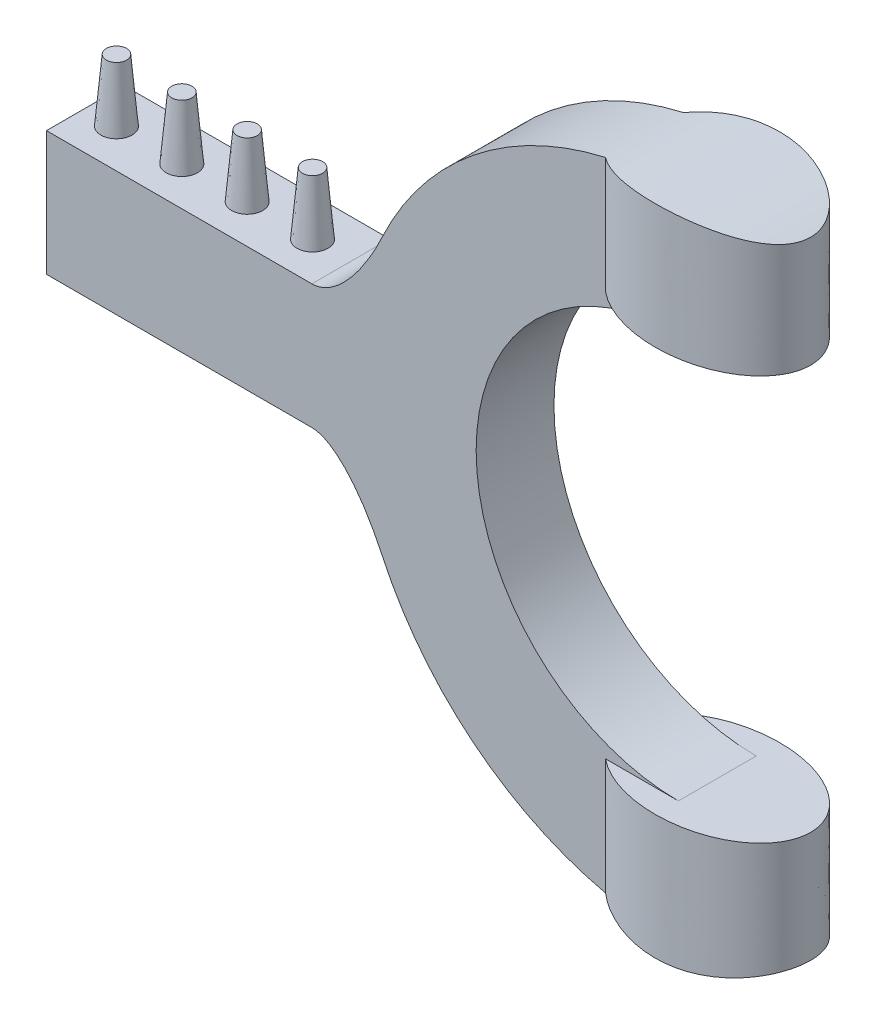
ISO-10303-21;
HEADER;
FILE_DESCRIPTION(('STEP AP214'),'2;1');
FILE_NAME('part.step','',(''),(''),'','','');
FILE_SCHEMA(('AUTOMOTIVE_DESIGN { 1 0 10303 214 1 1 1 1 }'));
ENDSEC;
DATA;
#1=APPLICATION_CONTEXT('core data for automotive mechanical design processes');
#2=APPLICATION_PROTOCOL_DEFINITION('international standard','automotive_design',2000,#1);
#3=PRODUCT_CONTEXT('',#1,'mechanical');
#4=PRODUCT('Part','Part','',(#3));
#5=PRODUCT_RELATED_PRODUCT_CATEGORY('part','',(#4));
#6=PRODUCT_DEFINITION_FORMATION('','',#4);
#7=PRODUCT_DEFINITION_CONTEXT('part definition',#1,'design');
#8=PRODUCT_DEFINITION('design','',#6,#7);
#9=PRODUCT_DEFINITION_SHAPE('','',#8);
#10=(LENGTH_UNIT() NAMED_UNIT(*) SI_UNIT(.MILLI.,.METRE.));
#11=(NAMED_UNIT(*) PLANE_ANGLE_UNIT() SI_UNIT($,.RADIAN.));
#12=(NAMED_UNIT(*) SI_UNIT($,.STERADIAN.) SOLID_ANGLE_UNIT());
#13=UNCERTAINTY_MEASURE_WITH_UNIT(LENGTH_MEASURE(1.E-05),#10,'distance_accuracy_value','');
#14=(GEOMETRIC_REPRESENTATION_CONTEXT(3) GLOBAL_UNCERTAINTY_ASSIGNED_CONTEXT((#13)) GLOBAL_UNIT_ASSIGNED_CONTEXT((#10,
#11,#12)) REPRESENTATION_CONTEXT('',''));
#15=CARTESIAN_POINT('',(0.,0.,0.));
#16=DIRECTION('',(0.,0.,1.));
#17=DIRECTION('',(1.,0.,0.));
#18=AXIS2_PLACEMENT_3D('',#15,#16,#17);
#19=CARTESIAN_POINT('',(0.,0.,1.25));
#20=DIRECTION('',(0.,0.,1.));
#21=DIRECTION('',(1.,0.,0.));
#22=AXIS2_PLACEMENT_3D('',#19,#20,#21);
#23=PLANE('',#22);
#24=DIRECTION('',(0.,1.,0.));
#25=VECTOR('',#24,1.);
#26=CARTESIAN_POINT('',(-2.3418742493994,-10.501,1.25));
#27=LINE('',#26,#25);
#28=CARTESIAN_POINT('',(-2.3418742493994,-6.50000000000001,1.25));
#29=VERTEX_POINT('',#28);
#30=CARTESIAN_POINT('',(-2.34187424939951,-10.2355080479671,1.2499999999999));
#31=VERTEX_POINT('',#30);
#32=EDGE_CURVE('E153',#29,#31,#27,.F.);
#33=ORIENTED_EDGE('',*,*,#32,.F.);
#34=DIRECTION('',(1.,0.,0.));
#35=VECTOR('',#34,1.);
#36=CARTESIAN_POINT('',(0.,-6.50000000000001,1.25));
#37=LINE('',#36,#35);
#38=CARTESIAN_POINT('',(0.,-6.50000000000001,1.25));
#39=VERTEX_POINT('',#38);
#40=EDGE_CURVE('E154',#29,#39,#37,.T.);
#41=ORIENTED_EDGE('',*,*,#40,.T.);
#42=CARTESIAN_POINT('',(0.,0.,1.25));
#43=DIRECTION('',(0.,0.,1.));
#44=DIRECTION('',(1.,0.,0.));
#45=AXIS2_PLACEMENT_3D('',#42,#43,#44);
#46=CIRCLE('',#45,6.50000000000001);
#47=CARTESIAN_POINT('',(1.74344773868003E-07,6.50000000000001,1.25));
#48=VERTEX_POINT('',#47);
#49=EDGE_CURVE('E228',#48,#39,#46,.T.);
#50=ORIENTED_EDGE('',*,*,#49,.F.);
#51=DIRECTION('',(-1.,0.,0.));
#52=VECTOR('',#51,1.);
#53=CARTESIAN_POINT('',(0.,6.50000000000001,1.25));
#54=LINE('',#53,#52);
#55=CARTESIAN_POINT('',(-2.3418742493994,6.50000000000001,1.25));
#56=VERTEX_POINT('',#55);
#57=EDGE_CURVE('E521',#48,#56,#54,.T.);
#58=ORIENTED_EDGE('',*,*,#57,.T.);
#59=DIRECTION('',(0.,-1.,0.));
#60=VECTOR('',#59,1.);
#61=CARTESIAN_POINT('',(-2.3418742493994,10.501,1.25));
#62=LINE('',#61,#60);
#63=CARTESIAN_POINT('',(-2.3418742493994,10.2355080479671,1.25));
#64=VERTEX_POINT('',#63);
#65=EDGE_CURVE('E196',#56,#64,#62,.F.);
#66=ORIENTED_EDGE('',*,*,#65,.T.);
#67=CARTESIAN_POINT('',(0.,0.,1.25));
#68=DIRECTION('',(0.,0.,1.));
#69=DIRECTION('',(1.,0.,0.));
#70=AXIS2_PLACEMENT_3D('',#67,#68,#69);
#71=CIRCLE('',#70,10.5);
#72=CARTESIAN_POINT('',(-9.51398456835327,4.44230769230769,1.25));
#73=VERTEX_POINT('',#72);
#74=EDGE_CURVE('E240',#64,#73,#71,.T.);
#75=ORIENTED_EDGE('',*,*,#74,.T.);
#76=CARTESIAN_POINT('',(-11.7792189893898,2.,1.25));
#77=CARTESIAN_POINT('',(-10.654356635448,2.,1.25));
#78=CARTESIAN_POINT('',(-9.51398456835327,4.44230769230769,1.25));
#79=(BOUNDED_CURVE() B_SPLINE_CURVE(2,(#76,#77,#78),.UNSPECIFIED.,.F.,
.F.) B_SPLINE_CURVE_WITH_KNOTS((3,3),(0.,1.),
.UNSPECIFIED.) CURVE() GEOMETRIC_REPRESENTATION_ITEM() RATIONAL_B_SPLINE_CURVE((1.,
0.843527392286973,1.)) REPRESENTATION_ITEM(''));
#80=CARTESIAN_POINT('',(-11.7792189893898,2.,1.25));
#81=VERTEX_POINT('',#80);
#82=EDGE_CURVE('E317',#73,#81,#79,.F.);
#83=ORIENTED_EDGE('',*,*,#82,.T.);
#84=DIRECTION('',(-1.,0.,0.));
#85=VECTOR('',#84,1.);
#86=CARTESIAN_POINT('',(0.,2.,1.25));
#87=LINE('',#86,#85);
#88=CARTESIAN_POINT('',(-20.3077640640442,2.,1.25));
#89=VERTEX_POINT('',#88);
#90=EDGE_CURVE('E243',#81,#89,#87,.T.);
#91=ORIENTED_EDGE('',*,*,#90,.T.);
#92=DIRECTION('',(0.,-1.,0.));
#93=VECTOR('',#92,1.);
#94=CARTESIAN_POINT('',(-20.3077640640442,0.,1.25));
#95=LINE('',#94,#93);
#96=CARTESIAN_POINT('',(-20.3077640640442,-2.,1.25));
#97=VERTEX_POINT('',#96);
#98=EDGE_CURVE('E267',#89,#97,#95,.T.);
#99=ORIENTED_EDGE('',*,*,#98,.T.);
#100=DIRECTION('',(-1.,0.,0.));
#101=VECTOR('',#100,1.);
#102=CARTESIAN_POINT('',(0.,-2.,1.25));
#103=LINE('',#102,#101);
#104=CARTESIAN_POINT('',(-11.7792189893898,-2.,1.25));
#105=VERTEX_POINT('',#104);
#106=EDGE_CURVE('E229',#105,#97,#103,.T.);
#107=ORIENTED_EDGE('',*,*,#106,.F.);
#108=CARTESIAN_POINT('',(-9.51398456835327,-4.44230769230769,1.25));
#109=CARTESIAN_POINT('',(-10.654356635448,-2.,1.25));
#110=CARTESIAN_POINT('',(-11.7792189893898,-2.,1.25));
#111=(BOUNDED_CURVE() B_SPLINE_CURVE(2,(#108,#109,#110),.UNSPECIFIED.,.F.,
.F.) B_SPLINE_CURVE_WITH_KNOTS((3,3),(0.,1.),
.UNSPECIFIED.) CURVE() GEOMETRIC_REPRESENTATION_ITEM() RATIONAL_B_SPLINE_CURVE((1.,
0.843527392286973,1.)) REPRESENTATION_ITEM(''));
#112=CARTESIAN_POINT('',(-9.51398456835327,-4.44230769230769,1.25));
#113=VERTEX_POINT('',#112);
#114=EDGE_CURVE('E12',#105,#113,#111,.F.);
#115=ORIENTED_EDGE('',*,*,#114,.T.);
#116=EDGE_CURVE('E220',#113,#31,#71,.T.);
#117=ORIENTED_EDGE('',*,*,#116,.T.);
#118=EDGE_LOOP('',(#33,#41,#50,#58,#66,#75,#83,#91,#99,#107,#115,#117));
#119=FACE_BOUND('',#118,.T.);
#120=ADVANCED_FACE('F48',(#119),#23,.T.);
#121=CARTESIAN_POINT('',(0.,0.,-1.25));
#122=DIRECTION('',(0.,0.,1.));
#123=DIRECTION('',(1.,0.,0.));
#124=AXIS2_PLACEMENT_3D('',#121,#122,#123);
#125=PLANE('',#124);
#126=DIRECTION('',(1.,0.,0.));
#127=VECTOR('',#126,1.);
#128=CARTESIAN_POINT('',(0.,-6.50000000000001,-1.25));
#129=LINE('',#128,#127);
#130=CARTESIAN_POINT('',(-2.3418742493994,-6.50000000000001,-1.25));
#131=VERTEX_POINT('',#130);
#132=CARTESIAN_POINT('',(1.74344773868003E-07,-6.50000000000001,-1.25));
#133=VERTEX_POINT('',#132);
#134=EDGE_CURVE('E158',#131,#133,#129,.T.);
#135=ORIENTED_EDGE('',*,*,#134,.F.);
#136=DIRECTION('',(0.,1.,0.));
#137=VECTOR('',#136,1.);
#138=CARTESIAN_POINT('',(-2.3418742493994,-10.501,-1.25));
#139=LINE('',#138,#137);
#140=CARTESIAN_POINT('',(-2.3418742493994,-10.2355080479671,-1.25));
#141=VERTEX_POINT('',#140);
#142=EDGE_CURVE('E144',#131,#141,#139,.F.);
#143=ORIENTED_EDGE('',*,*,#142,.T.);
#144=CARTESIAN_POINT('',(0.,0.,-1.25));
#145=DIRECTION('',(0.,0.,1.));
#146=DIRECTION('',(1.,0.,0.));
#147=AXIS2_PLACEMENT_3D('',#144,#145,#146);
#148=CIRCLE('',#147,10.5);
#149=CARTESIAN_POINT('',(-9.51398456835327,-4.44230769230769,-1.25));
#150=VERTEX_POINT('',#149);
#151=EDGE_CURVE('E230',#150,#141,#148,.T.);
#152=ORIENTED_EDGE('',*,*,#151,.F.);
#153=CARTESIAN_POINT('',(-11.7792189893898,-2.,-1.25));
#154=CARTESIAN_POINT('',(-10.654356635448,-2.,-1.25));
#155=CARTESIAN_POINT('',(-9.51398456835327,-4.44230769230769,-1.25));
#156=(BOUNDED_CURVE() B_SPLINE_CURVE(2,(#153,#154,#155),.UNSPECIFIED.,.F.,
.F.) B_SPLINE_CURVE_WITH_KNOTS((3,3),(0.,1.),
.UNSPECIFIED.) CURVE() GEOMETRIC_REPRESENTATION_ITEM() RATIONAL_B_SPLINE_CURVE((1.,
0.843527392286973,1.)) REPRESENTATION_ITEM(''));
#157=CARTESIAN_POINT('',(-11.7792189893898,-2.,-1.25));
#158=VERTEX_POINT('',#157);
#159=EDGE_CURVE('E62',#150,#158,#156,.F.);
#160=ORIENTED_EDGE('',*,*,#159,.T.);
#161=DIRECTION('',(-1.,0.,0.));
#162=VECTOR('',#161,1.);
#163=CARTESIAN_POINT('',(0.,-2.,-1.25));
#164=LINE('',#163,#162);
#165=CARTESIAN_POINT('',(-20.3077640640442,-2.,-1.25));
#166=VERTEX_POINT('',#165);
#167=EDGE_CURVE('E439',#158,#166,#164,.T.);
#168=ORIENTED_EDGE('',*,*,#167,.T.);
#169=DIRECTION('',(0.,-1.,0.));
#170=VECTOR('',#169,1.);
#171=CARTESIAN_POINT('',(-20.3077640640442,0.,-1.25));
#172=LINE('',#171,#170);
#173=CARTESIAN_POINT('',(-20.3077640640442,2.,-1.25));
#174=VERTEX_POINT('',#173);
#175=EDGE_CURVE('E260',#174,#166,#172,.T.);
#176=ORIENTED_EDGE('',*,*,#175,.F.);
#177=DIRECTION('',(-1.,0.,0.));
#178=VECTOR('',#177,1.);
#179=CARTESIAN_POINT('',(0.,2.,-1.25));
#180=LINE('',#179,#178);
#181=CARTESIAN_POINT('',(-11.7792189893898,2.,-1.25));
#182=VERTEX_POINT('',#181);
#183=EDGE_CURVE('E247',#182,#174,#180,.T.);
#184=ORIENTED_EDGE('',*,*,#183,.F.);
#185=CARTESIAN_POINT('',(-9.51398456835327,4.44230769230769,-1.25));
#186=CARTESIAN_POINT('',(-10.654356635448,2.,-1.25));
#187=CARTESIAN_POINT('',(-11.7792189893898,2.,-1.25));
#188=(BOUNDED_CURVE() B_SPLINE_CURVE(2,(#185,#186,#187),.UNSPECIFIED.,.F.,
.F.) B_SPLINE_CURVE_WITH_KNOTS((3,3),(0.,1.),
.UNSPECIFIED.) CURVE() GEOMETRIC_REPRESENTATION_ITEM() RATIONAL_B_SPLINE_CURVE((1.,
0.843527392286973,1.)) REPRESENTATION_ITEM(''));
#189=CARTESIAN_POINT('',(-9.51398456835327,4.44230769230769,-1.25));
#190=VERTEX_POINT('',#189);
#191=EDGE_CURVE('E316',#182,#190,#188,.F.);
#192=ORIENTED_EDGE('',*,*,#191,.T.);
#193=CARTESIAN_POINT('',(-2.34187424941647,10.2355080479632,-1.25));
#194=VERTEX_POINT('',#193);
#195=EDGE_CURVE('E244',#194,#190,#148,.T.);
#196=ORIENTED_EDGE('',*,*,#195,.F.);
#197=DIRECTION('',(0.,-1.,0.));
#198=VECTOR('',#197,1.);
#199=CARTESIAN_POINT('',(-2.3418742493994,10.501,-1.25));
#200=LINE('',#199,#198);
#201=CARTESIAN_POINT('',(-2.3418742493994,6.50000000000001,-1.25));
#202=VERTEX_POINT('',#201);
#203=EDGE_CURVE('E296',#202,#194,#200,.F.);
#204=ORIENTED_EDGE('',*,*,#203,.F.);
#205=DIRECTION('',(-1.,0.,0.));
#206=VECTOR('',#205,1.);
#207=CARTESIAN_POINT('',(0.,6.50000000000001,-1.25));
#208=LINE('',#207,#206);
#209=CARTESIAN_POINT('',(1.74344773868003E-07,6.50000000000001,-1.25));
#210=VERTEX_POINT('',#209);
#211=EDGE_CURVE('E265',#210,#202,#208,.T.);
#212=ORIENTED_EDGE('',*,*,#211,.F.);
#213=CARTESIAN_POINT('',(0.,0.,-1.25));
#214=DIRECTION('',(0.,0.,1.));
#215=DIRECTION('',(1.,0.,0.));
#216=AXIS2_PLACEMENT_3D('',#213,#214,#215);
#217=CIRCLE('',#216,6.50000000000001);
#218=EDGE_CURVE('E166',#210,#133,#217,.T.);
#219=ORIENTED_EDGE('',*,*,#218,.T.);
#220=EDGE_LOOP('',(#135,#143,#152,#160,#168,#176,#184,#192,#196,#204,#212,#219));
#221=FACE_BOUND('',#220,.T.);
#222=ADVANCED_FACE('F163',(#221),#125,.F.);
#223=CARTESIAN_POINT('',(0.,-2.,1.25));
#224=DIRECTION('',(0.,-1.,0.));
#225=DIRECTION('',(1.,0.,0.));
#226=AXIS2_PLACEMENT_3D('',#223,#224,#225);
#227=PLANE('',#226);
#228=ORIENTED_EDGE('',*,*,#167,.F.);
#229=CARTESIAN_POINT('',(-11.7792189893898,-2.,1.375));
#230=CARTESIAN_POINT('',(-11.7792189893898,-2.,0.458333333333334));
#231=CARTESIAN_POINT('',(-11.7792189893898,-2.,-0.458333333333335));
#232=CARTESIAN_POINT('',(-11.7792189893898,-2.,-1.375));
#233=(BOUNDED_CURVE() B_SPLINE_CURVE(3,(#229,#230,#231,#232),.UNSPECIFIED.,.F.,
.F.) B_SPLINE_CURVE_WITH_KNOTS((4,4),(-0.000125,0.002625),
.UNSPECIFIED.) CURVE() GEOMETRIC_REPRESENTATION_ITEM() RATIONAL_B_SPLINE_CURVE((1.,1.,1.,1.)) REPRESENTATION_ITEM(''));
#234=EDGE_CURVE('E69',#158,#105,#233,.F.);
#235=ORIENTED_EDGE('',*,*,#234,.T.);
#236=ORIENTED_EDGE('',*,*,#106,.T.);
#237=DIRECTION('',(0.,0.,-1.));
#238=VECTOR('',#237,1.);
#239=CARTESIAN_POINT('',(-20.3077640640442,-2.,1.25));
#240=LINE('',#239,#238);
#241=EDGE_CURVE('E271',#97,#166,#240,.T.);
#242=ORIENTED_EDGE('',*,*,#241,.T.);
#243=EDGE_LOOP('',(#228,#235,#236,#242));
#244=FACE_BOUND('',#243,.T.);
#245=ADVANCED_FACE('F349',(#244),#227,.T.);
#246=CARTESIAN_POINT('',(0.,0.,1.25));
#247=DIRECTION('',(0.,0.,-1.));
#248=DIRECTION('',(-1.,0.,0.));
#249=AXIS2_PLACEMENT_3D('',#246,#247,#248);
#250=CYLINDRICAL_SURFACE('',#249,10.5);
#251=ORIENTED_EDGE('',*,*,#116,.F.);
#252=CARTESIAN_POINT('',(-9.51398456835327,-4.44230769230769,-1.375));
#253=CARTESIAN_POINT('',(-9.51398456835327,-4.44230769230769,-0.458333333333335));
#254=CARTESIAN_POINT('',(-9.51398456835327,-4.44230769230769,0.458333333333334));
#255=CARTESIAN_POINT('',(-9.51398456835327,-4.44230769230769,1.375));
#256=(BOUNDED_CURVE() B_SPLINE_CURVE(3,(#252,#253,#254,#255),.UNSPECIFIED.,.F.,
.F.) B_SPLINE_CURVE_WITH_KNOTS((4,4),(-0.000125,0.002625),
.UNSPECIFIED.) CURVE() GEOMETRIC_REPRESENTATION_ITEM() RATIONAL_B_SPLINE_CURVE((1.,1.,1.,1.)) REPRESENTATION_ITEM(''));
#257=EDGE_CURVE('E309',#113,#150,#256,.F.);
#258=ORIENTED_EDGE('',*,*,#257,.T.);
#259=ORIENTED_EDGE('',*,*,#151,.T.);
#260=CARTESIAN_POINT('',(3.,-10.0623058987491,0.));
#261=CARTESIAN_POINT('',(3.00000355148865,-10.0623044663721,0.0383384686052917));
#262=CARTESIAN_POINT('',(2.99834387134299,-10.0628000827771,0.0766593487127265));
#263=CARTESIAN_POINT('',(2.99175953435985,-10.064759659748,0.152988874087551));
#264=CARTESIAN_POINT('',(2.98683525597735,-10.0662235080697,0.190997555030235));
#265=CARTESIAN_POINT('',(2.96729159316161,-10.072009552565,0.304120114664266));
#266=CARTESIAN_POINT('',(2.9479011715399,-10.0777263445167,0.378386120084359));
#267=CARTESIAN_POINT('',(2.89785114927975,-10.0922310115898,0.522768730191567));
#268=CARTESIAN_POINT('',(2.86716416398637,-10.1010263470177,0.592874766858009));
#269=CARTESIAN_POINT('',(2.78410170445636,-10.1242881824639,0.751176308225388));
#270=CARTESIAN_POINT('',(2.72789550603402,-10.1396637419142,0.837221910100244));
#271=CARTESIAN_POINT('',(2.60267621004931,-10.1725248443808,0.998837315614147));
#272=CARTESIAN_POINT('',(2.53364981989799,-10.1900125707512,1.07439610263471));
#273=CARTESIAN_POINT('',(2.40713883121449,-10.2205009884325,1.19520614715843));
#274=CARTESIAN_POINT('',(2.35196286999848,-10.2333617432041,1.24296174051363));
#275=CARTESIAN_POINT('',(2.23771608694713,-10.2589501579878,1.33341358460814));
#276=CARTESIAN_POINT('',(2.17864997971553,-10.2716779582108,1.37611579028533));
#277=CARTESIAN_POINT('',(1.99674106224522,-10.3091344718429,1.49701214799829));
#278=CARTESIAN_POINT('',(1.86900960740744,-10.3331803913179,1.5681596604057));
#279=CARTESIAN_POINT('',(1.64632197901792,-10.3705423582829,1.67358348232029));
#280=CARTESIAN_POINT('',(1.55360859075124,-10.3848622247321,1.71243221880166));
#281=CARTESIAN_POINT('',(1.36500182397551,-10.4113324572017,1.78243469932056));
#282=CARTESIAN_POINT('',(1.26910775716407,-10.4234823499574,1.81358676530382));
#283=CARTESIAN_POINT('',(0.978134845975914,-10.4561546496284,1.89592061071668));
#284=CARTESIAN_POINT('',(0.779438403350443,-10.4729559553316,1.93612942370534));
#285=CARTESIAN_POINT('',(0.377992116589557,-10.4951234641136,1.9887402613362));
#286=CARTESIAN_POINT('',(0.175243473811245,-10.5004930070627,2.001150407611));
#287=CARTESIAN_POINT('',(-0.230050302118865,-10.4994354740395,1.9986827117641));
#288=CARTESIAN_POINT('',(-0.432595440796637,-10.4930087275492,1.98380563180206));
#289=CARTESIAN_POINT('',(-0.833216890346059,-10.4688070119475,1.92616561823626));
#290=CARTESIAN_POINT('',(-1.03129221451726,-10.4510295620833,1.88339658866461));
#291=CARTESIAN_POINT('',(-1.31735006757053,-10.4174591147776,1.79814274457026));
#292=CARTESIAN_POINT('',(-1.40925436847928,-10.4054010161198,1.76696718269324));
#293=CARTESIAN_POINT('',(-1.58999252698791,-10.3793173628479,1.69742425380519));
#294=CARTESIAN_POINT('',(-1.6788280791934,-10.3652929164465,1.65906093367103));
#295=CARTESIAN_POINT('',(-1.83857966488312,-10.3380411752212,1.58152499813791));
#296=CARTESIAN_POINT('',(-1.910079370374,-10.3250486015117,1.54347544831441));
#297=CARTESIAN_POINT('',(-2.04960851054148,-10.2982603444963,1.46176973555338));
#298=CARTESIAN_POINT('',(-2.11763832022466,-10.2844647483229,1.41811418028247));
#299=CARTESIAN_POINT('',(-2.29184632846094,-10.2474186926983,1.29483845386218));
#300=CARTESIAN_POINT('',(-2.39450592076045,-10.2237792971473,1.21011018132249));
#301=CARTESIAN_POINT('',(-2.5274317774128,-10.1913546890605,1.07845337093133));
#302=CARTESIAN_POINT('',(-2.56473238599537,-10.1820188377763,1.03864274170418));
#303=CARTESIAN_POINT('',(-2.63606341653805,-10.1637847345612,0.955985938928602));
#304=CARTESIAN_POINT('',(-2.67008906713307,-10.1548871300627,0.913135489764209));
#305=CARTESIAN_POINT('',(-2.75705348418465,-10.1317259917912,0.792914927967232));
#306=CARTESIAN_POINT('',(-2.8062706781031,-10.1181373260819,0.71263457591213));
#307=CARTESIAN_POINT('',(-2.88987890798953,-10.0945784691058,0.544147932334288));
#308=CARTESIAN_POINT('',(-2.92428892734605,-10.0846036473573,0.455951965421194));
#309=CARTESIAN_POINT('',(-2.96920508843688,-10.07145658395,0.29466362920067));
#310=CARTESIAN_POINT('',(-2.98335924144341,-10.0672555374229,0.22267224286817));
#311=CARTESIAN_POINT('',(-2.99975101291128,-10.0623840935654,0.0772475434684205));
#312=CARTESIAN_POINT('',(-3.00199818875726,-10.061710864563,0.00381543436612049));
#313=CARTESIAN_POINT('',(-2.99440307389354,-10.0639735187965,-0.142334418442069));
#314=CARTESIAN_POINT('',(-2.98456349992209,-10.0669085909947,-0.215052318977917));
#315=CARTESIAN_POINT('',(-2.9535796783709,-10.0760419272663,-0.357837293176792));
#316=CARTESIAN_POINT('',(-2.93242514744247,-10.0822431596386,-0.42790189332318));
#317=CARTESIAN_POINT('',(-2.87333212460186,-10.0992639806107,-0.581817193284468));
#318=CARTESIAN_POINT('',(-2.83244112182927,-10.1108696395155,-0.664440937277422));
#319=CARTESIAN_POINT('',(-2.73810716899812,-10.1368213820675,-0.821641439510823));
#320=CARTESIAN_POINT('',(-2.68465070941905,-10.151170412079,-0.896209409899986));
#321=CARTESIAN_POINT('',(-2.58581232318606,-10.1767056818457,-1.01557351347719));
#322=CARTESIAN_POINT('',(-2.54289924075685,-10.1875311378469,-1.06253965329657));
#323=CARTESIAN_POINT('',(-2.45322825734425,-10.2094958516812,-1.15243062857468));
#324=CARTESIAN_POINT('',(-2.40647486109723,-10.220634732054,-1.19536007579049));
#325=CARTESIAN_POINT('',(-2.26147619669917,-10.2540477398763,-1.31827778767578));
#326=CARTESIAN_POINT('',(-2.15834928712955,-10.2763562168689,-1.39256184183122));
#327=CARTESIAN_POINT('',(-1.97387941027623,-10.313098093723,-1.50774159017472));
#328=CARTESIAN_POINT('',(-1.89471671542793,-10.3279622856854,-1.55211628382282));
#329=CARTESIAN_POINT('',(-1.7327090793942,-10.3563743511648,-1.63408885002178));
#330=CARTESIAN_POINT('',(-1.64986308596422,-10.3699218449599,-1.67168477030309));
#331=CARTESIAN_POINT('',(-1.39729524928184,-10.4079971761136,-1.77470256160851));
#332=CARTESIAN_POINT('',(-1.2232194452011,-10.4300241870526,-1.83054944709625));
#333=CARTESIAN_POINT('',(-0.868602992848357,-10.4655322498054,-1.91848177036113));
#334=CARTESIAN_POINT('',(-0.688065308416566,-10.4790171678312,-1.95057795898069));
#335=CARTESIAN_POINT('',(-0.323995016569385,-10.4965813672545,-1.99210775320085));
#336=CARTESIAN_POINT('',(-0.140462964557065,-10.5006623733816,-2.00154551449622));
#337=CARTESIAN_POINT('',(0.22634893164756,-10.4991619973292,-1.99804466454611));
#338=CARTESIAN_POINT('',(0.409628779217311,-10.493580745829,-1.98510635593103));
#339=CARTESIAN_POINT('',(0.772656574612584,-10.4731119200922,-1.93646936756995));
#340=CARTESIAN_POINT('',(0.952403990321355,-10.4582229546814,-1.90076728542883));
#341=CARTESIAN_POINT('',(1.30480255456368,-10.4201155457152,-1.80538487494826));
#342=CARTESIAN_POINT('',(1.4774508914681,-10.3968938366815,-1.7456951451047));
#343=CARTESIAN_POINT('',(1.72248188956221,-10.3580621651541,-1.63868056228378));
#344=CARTESIAN_POINT('',(1.79973036101952,-10.3448952616697,-1.6014322962553));
#345=CARTESIAN_POINT('',(1.95074720890805,-10.3174840301058,-1.52081176823471));
#346=CARTESIAN_POINT('',(2.024515803083,-10.3032397695844,-1.47743989009068));
#347=CARTESIAN_POINT('',(2.2125491510595,-10.2649220598529,-1.35500650462222));
#348=CARTESIAN_POINT('',(2.32336321914525,-10.2402610413341,-1.2705614104601));
#349=CARTESIAN_POINT('',(2.46767707429305,-10.2060017832118,-1.13835332383765));
#350=CARTESIAN_POINT('',(2.5082682832503,-10.19608777054,-1.09828384476564));
#351=CARTESIAN_POINT('',(2.58614615174022,-10.1766131193016,-1.01484354643495));
#352=CARTESIAN_POINT('',(2.62342767939437,-10.1670530424675,-0.971467787635933));
#353=CARTESIAN_POINT('',(2.71867146934232,-10.1421225491115,-0.849985119975552));
#354=CARTESIAN_POINT('',(2.77292249641575,-10.1273500617357,-0.768754455167239));
#355=CARTESIAN_POINT('',(2.86627169031687,-10.1013297971211,-0.597422569835611));
#356=CARTESIAN_POINT('',(2.90539221466455,-10.0900768240323,-0.507334686121194));
#357=CARTESIAN_POINT('',(2.95620547614681,-10.0752833508004,-0.347275908742136));
#358=CARTESIAN_POINT('',(2.97253752630664,-10.0704588291723,-0.278888807115769));
#359=CARTESIAN_POINT('',(2.99442217195432,-10.0639741632049,-0.140312622399601));
#360=CARTESIAN_POINT('',(2.99999350378735,-10.0623085187843,-0.0701268874270185));
#361=CARTESIAN_POINT('',(3.,-10.0623058987491,0.));
#362=B_SPLINE_CURVE_WITH_KNOTS('',3,(#260,#261,#262,#263,#264,#265,#266,#267,#268,#269,#270,
#271,#272,#273,#274,#275,#276,#277,#278,#279,#280,#281,#282,#283,#284,#285,#286,#287,#288,#289,
#290,#291,#292,#293,#294,#295,#296,#297,#298,#299,#300,#301,#302,#303,#304,#305,#306,#307,#308,
#309,#310,#311,#312,#313,#314,#315,#316,#317,#318,#319,#320,#321,#322,#323,#324,#325,#326,#327,
#328,#329,#330,#331,#332,#333,#334,#335,#336,#337,#338,#339,#340,#341,#342,#343,#344,#345,#346,
#347,#348,#349,#350,#351,#352,#353,#354,#355,#356,#357,#358,#359,#360,#361),.UNSPECIFIED.,.T.,
.F.,(4,2,2,2,2,2,2,2,2,2,2,2,2,2,2,2,2,2,2,2,2,2,2,2,2,2,2,2,2,2,2,2,2,2,2,2,2,2,2,2,2,2,2,2,2,
2,2,2,2,2,4),(0.,0.1149423543301,0.22987138607101,0.459564972932458,0.689819079997189,
0.999862388675535,1.31022897814091,1.53223739535492,1.75398153515828,2.19674085783565,
2.50103177284158,2.80538897196008,3.41302504075854,4.02048356000107,4.62792511257507,
5.23549946998287,5.52861928046277,5.82157455084609,6.06740068436476,6.31320019385658,
6.71665515880936,6.88255366637284,7.04869032852921,7.33277020081512,7.61648477837705,
7.83596888557527,8.05527679253958,8.27453541469339,8.49399364463531,8.77123024098661,
9.04876627761253,9.24212172800105,9.4352535232104,9.82085650293272,10.0964354670941,
10.3720936709692,10.9222715860436,11.4722003084171,12.022028162777,12.5718485809195,
13.1217511974272,13.671869548369,13.9319089890619,14.1919321368611,14.6141924276627,
14.787717908269,14.9615079160639,15.2565073080318,15.5510691147225,15.761683203492,
15.9719302435),.UNSPECIFIED.);
#363=EDGE_CURVE('E151',#141,#31,#362,.T.);
#364=ORIENTED_EDGE('',*,*,#363,.T.);
#365=EDGE_LOOP('',(#251,#258,#259,#364));
#366=FACE_BOUND('',#365,.T.);
#367=ADVANCED_FACE('F206',(#366),#250,.T.);
#368=CARTESIAN_POINT('',(0.,0.,1.25));
#369=DIRECTION('',(0.,0.,-1.));
#370=DIRECTION('',(-1.,0.,0.));
#371=AXIS2_PLACEMENT_3D('',#368,#369,#370);
#372=CYLINDRICAL_SURFACE('',#371,6.50000000000001);
#373=ORIENTED_EDGE('',*,*,#218,.F.);
#374=DIRECTION('',(0.,0.,-1.));
#375=VECTOR('',#374,1.);
#376=CARTESIAN_POINT('',(1.74344773868003E-07,6.50000000000001,1.25));
#377=LINE('',#376,#375);
#378=EDGE_CURVE('E279',#48,#210,#377,.T.);
#379=ORIENTED_EDGE('',*,*,#378,.F.);
#380=ORIENTED_EDGE('',*,*,#49,.T.);
#381=DIRECTION('',(0.,0.,-1.));
#382=VECTOR('',#381,1.);
#383=CARTESIAN_POINT('',(1.74344773868003E-07,-6.50000000000001,1.25));
#384=LINE('',#383,#382);
#385=EDGE_CURVE('E283',#39,#133,#384,.T.);
#386=ORIENTED_EDGE('',*,*,#385,.T.);
#387=EDGE_LOOP('',(#373,#379,#380,#386));
#388=FACE_BOUND('',#387,.T.);
#389=ADVANCED_FACE('F204',(#388),#372,.F.);
#390=ORIENTED_EDGE('',*,*,#195,.T.);
#391=CARTESIAN_POINT('',(-9.51398456835327,4.44230769230769,1.375));
#392=CARTESIAN_POINT('',(-9.51398456835327,4.44230769230769,0.458333333333334));
#393=CARTESIAN_POINT('',(-9.51398456835327,4.44230769230769,-0.458333333333335));
#394=CARTESIAN_POINT('',(-9.51398456835327,4.44230769230769,-1.375));
#395=(BOUNDED_CURVE() B_SPLINE_CURVE(3,(#391,#392,#393,#394),.UNSPECIFIED.,.F.,
.F.) B_SPLINE_CURVE_WITH_KNOTS((4,4),(-0.000125,0.002625),
.UNSPECIFIED.) CURVE() GEOMETRIC_REPRESENTATION_ITEM() RATIONAL_B_SPLINE_CURVE((1.,1.,1.,1.)) REPRESENTATION_ITEM(''));
#396=EDGE_CURVE('E304',#190,#73,#395,.F.);
#397=ORIENTED_EDGE('',*,*,#396,.T.);
#398=ORIENTED_EDGE('',*,*,#74,.F.);
#399=CARTESIAN_POINT('',(3.,10.0623058987491,0.));
#400=CARTESIAN_POINT('',(3.00000355148865,10.0623044663721,0.0383384686052917));
#401=CARTESIAN_POINT('',(2.99834387134299,10.0628000827771,0.0766593487127265));
#402=CARTESIAN_POINT('',(2.99175953435985,10.064759659748,0.152988874087551));
#403=CARTESIAN_POINT('',(2.98683525597735,10.0662235080697,0.190997555030235));
#404=CARTESIAN_POINT('',(2.96729159316161,10.072009552565,0.304120114664266));
#405=CARTESIAN_POINT('',(2.9479011715399,10.0777263445167,0.378386120084359));
#406=CARTESIAN_POINT('',(2.89785114927975,10.0922310115898,0.522768730191567));
#407=CARTESIAN_POINT('',(2.86716416398637,10.1010263470177,0.592874766858009));
#408=CARTESIAN_POINT('',(2.78410170445636,10.1242881824639,0.751176308225388));
#409=CARTESIAN_POINT('',(2.72789550603402,10.1396637419142,0.837221910100244));
#410=CARTESIAN_POINT('',(2.60267621004931,10.1725248443808,0.998837315614147));
#411=CARTESIAN_POINT('',(2.53364981989799,10.1900125707512,1.07439610263471));
#412=CARTESIAN_POINT('',(2.40713883121449,10.2205009884325,1.19520614715843));
#413=CARTESIAN_POINT('',(2.35196286999848,10.2333617432041,1.24296174051363));
#414=CARTESIAN_POINT('',(2.23771608694713,10.2589501579878,1.33341358460814));
#415=CARTESIAN_POINT('',(2.17864997971553,10.2716779582108,1.37611579028533));
#416=CARTESIAN_POINT('',(1.99674106224522,10.3091344718429,1.49701214799829));
#417=CARTESIAN_POINT('',(1.86900960740744,10.3331803913179,1.5681596604057));
#418=CARTESIAN_POINT('',(1.64632197901792,10.3705423582829,1.67358348232029));
#419=CARTESIAN_POINT('',(1.55360859075124,10.3848622247321,1.71243221880166));
#420=CARTESIAN_POINT('',(1.36500182397551,10.4113324572017,1.78243469932056));
#421=CARTESIAN_POINT('',(1.26910775716407,10.4234823499574,1.81358676530382));
#422=CARTESIAN_POINT('',(0.978134845975914,10.4561546496284,1.89592061071668));
#423=CARTESIAN_POINT('',(0.779438403350443,10.4729559553316,1.93612942370534));
#424=CARTESIAN_POINT('',(0.377992116589557,10.4951234641136,1.9887402613362));
#425=CARTESIAN_POINT('',(0.175243473811245,10.5004930070627,2.001150407611));
#426=CARTESIAN_POINT('',(-0.230050302118865,10.4994354740395,1.9986827117641));
#427=CARTESIAN_POINT('',(-0.432595440796637,10.4930087275492,1.98380563180206));
#428=CARTESIAN_POINT('',(-0.833216890346059,10.4688070119475,1.92616561823626));
#429=CARTESIAN_POINT('',(-1.03129221451726,10.4510295620833,1.88339658866461));
#430=CARTESIAN_POINT('',(-1.31735006757053,10.4174591147776,1.79814274457026));
#431=CARTESIAN_POINT('',(-1.40925436847928,10.4054010161198,1.76696718269324));
#432=CARTESIAN_POINT('',(-1.58999252698791,10.3793173628479,1.69742425380519));
#433=CARTESIAN_POINT('',(-1.6788280791934,10.3652929164465,1.65906093367103));
#434=CARTESIAN_POINT('',(-1.83857966488312,10.3380411752212,1.58152499813791));
#435=CARTESIAN_POINT('',(-1.910079370374,10.3250486015117,1.54347544831441));
#436=CARTESIAN_POINT('',(-2.04960851054148,10.2982603444963,1.46176973555338));
#437=CARTESIAN_POINT('',(-2.11763832022466,10.2844647483229,1.41811418028247));
#438=CARTESIAN_POINT('',(-2.29184632846094,10.2474186926983,1.29483845386218));
#439=CARTESIAN_POINT('',(-2.39450592076045,10.2237792971473,1.21011018132249));
#440=CARTESIAN_POINT('',(-2.5274317774128,10.1913546890605,1.07845337093133));
#441=CARTESIAN_POINT('',(-2.56473238599537,10.1820188377763,1.03864274170418));
#442=CARTESIAN_POINT('',(-2.63606341653805,10.1637847345612,0.955985938928602));
#443=CARTESIAN_POINT('',(-2.67008906713307,10.1548871300627,0.913135489764209));
#444=CARTESIAN_POINT('',(-2.75705348418465,10.1317259917912,0.792914927967232));
#445=CARTESIAN_POINT('',(-2.8062706781031,10.1181373260819,0.71263457591213));
#446=CARTESIAN_POINT('',(-2.88987890798953,10.0945784691058,0.544147932334288));
#447=CARTESIAN_POINT('',(-2.92428892734605,10.0846036473573,0.455951965421194));
#448=CARTESIAN_POINT('',(-2.96920508843688,10.07145658395,0.29466362920067));
#449=CARTESIAN_POINT('',(-2.98335924144341,10.0672555374229,0.22267224286817));
#450=CARTESIAN_POINT('',(-2.99975101291128,10.0623840935654,0.0772475434684205));
#451=CARTESIAN_POINT('',(-3.00199818875726,10.061710864563,0.00381543436612049));
#452=CARTESIAN_POINT('',(-2.99440307389354,10.0639735187965,-0.142334418442069));
#453=CARTESIAN_POINT('',(-2.98456349992209,10.0669085909947,-0.215052318977917));
#454=CARTESIAN_POINT('',(-2.9535796783709,10.0760419272663,-0.357837293176792));
#455=CARTESIAN_POINT('',(-2.93242514744247,10.0822431596386,-0.42790189332318));
#456=CARTESIAN_POINT('',(-2.87333212460186,10.0992639806107,-0.581817193284468));
#457=CARTESIAN_POINT('',(-2.83244112182927,10.1108696395155,-0.664440937277422));
#458=CARTESIAN_POINT('',(-2.73810716899812,10.1368213820675,-0.821641439510823));
#459=CARTESIAN_POINT('',(-2.68465070941905,10.151170412079,-0.896209409899986));
#460=CARTESIAN_POINT('',(-2.58581232318606,10.1767056818457,-1.01557351347719));
#461=CARTESIAN_POINT('',(-2.54289924075685,10.1875311378469,-1.06253965329657));
#462=CARTESIAN_POINT('',(-2.45322825734425,10.2094958516812,-1.15243062857468));
#463=CARTESIAN_POINT('',(-2.40647486109723,10.220634732054,-1.19536007579049));
#464=CARTESIAN_POINT('',(-2.26147619669917,10.2540477398763,-1.31827778767578));
#465=CARTESIAN_POINT('',(-2.15834928712955,10.2763562168689,-1.39256184183122));
#466=CARTESIAN_POINT('',(-1.97387941027623,10.313098093723,-1.50774159017472));
#467=CARTESIAN_POINT('',(-1.89471671542793,10.3279622856854,-1.55211628382282));
#468=CARTESIAN_POINT('',(-1.7327090793942,10.3563743511648,-1.63408885002178));
#469=CARTESIAN_POINT('',(-1.64986308596422,10.3699218449599,-1.67168477030309));
#470=CARTESIAN_POINT('',(-1.39729524928184,10.4079971761136,-1.77470256160851));
#471=CARTESIAN_POINT('',(-1.2232194452011,10.4300241870526,-1.83054944709625));
#472=CARTESIAN_POINT('',(-0.868602992848357,10.4655322498054,-1.91848177036113));
#473=CARTESIAN_POINT('',(-0.688065308416566,10.4790171678312,-1.95057795898069));
#474=CARTESIAN_POINT('',(-0.323995016569385,10.4965813672545,-1.99210775320085));
#475=CARTESIAN_POINT('',(-0.140462964557065,10.5006623733816,-2.00154551449622));
#476=CARTESIAN_POINT('',(0.22634893164756,10.4991619973292,-1.99804466454611));
#477=CARTESIAN_POINT('',(0.409628779217311,10.493580745829,-1.98510635593103));
#478=CARTESIAN_POINT('',(0.772656574612584,10.4731119200922,-1.93646936756995));
#479=CARTESIAN_POINT('',(0.952403990321355,10.4582229546814,-1.90076728542883));
#480=CARTESIAN_POINT('',(1.30480255456368,10.4201155457152,-1.80538487494826));
#481=CARTESIAN_POINT('',(1.4774508914681,10.3968938366815,-1.7456951451047));
#482=CARTESIAN_POINT('',(1.72248188956221,10.3580621651541,-1.63868056228378));
#483=CARTESIAN_POINT('',(1.79973036101952,10.3448952616697,-1.6014322962553));
#484=CARTESIAN_POINT('',(1.95074720890805,10.3174840301058,-1.52081176823471));
#485=CARTESIAN_POINT('',(2.024515803083,10.3032397695844,-1.47743989009068));
#486=CARTESIAN_POINT('',(2.2125491510595,10.2649220598529,-1.35500650462222));
#487=CARTESIAN_POINT('',(2.32336321914525,10.2402610413341,-1.2705614104601));
#488=CARTESIAN_POINT('',(2.46767707429305,10.2060017832118,-1.13835332383765));
#489=CARTESIAN_POINT('',(2.5082682832503,10.19608777054,-1.09828384476564));
#490=CARTESIAN_POINT('',(2.58614615174022,10.1766131193016,-1.01484354643495));
#491=CARTESIAN_POINT('',(2.62342767939437,10.1670530424675,-0.971467787635933));
#492=CARTESIAN_POINT('',(2.71867146934232,10.1421225491115,-0.849985119975552));
#493=CARTESIAN_POINT('',(2.77292249641575,10.1273500617357,-0.768754455167239));
#494=CARTESIAN_POINT('',(2.86627169031687,10.1013297971211,-0.597422569835611));
#495=CARTESIAN_POINT('',(2.90539221466455,10.0900768240323,-0.507334686121194));
#496=CARTESIAN_POINT('',(2.95620547614681,10.0752833508004,-0.347275908742136));
#497=CARTESIAN_POINT('',(2.97253752630664,10.0704588291723,-0.278888807115769));
#498=CARTESIAN_POINT('',(2.99442217195432,10.0639741632049,-0.140312622399601));
#499=CARTESIAN_POINT('',(2.99999350378735,10.0623085187843,-0.0701268874270185));
#500=CARTESIAN_POINT('',(3.,10.0623058987491,0.));
#501=B_SPLINE_CURVE_WITH_KNOTS('',3,(#399,#400,#401,#402,#403,#404,#405,#406,#407,#408,#409,
#410,#411,#412,#413,#414,#415,#416,#417,#418,#419,#420,#421,#422,#423,#424,#425,#426,#427,#428,
#429,#430,#431,#432,#433,#434,#435,#436,#437,#438,#439,#440,#441,#442,#443,#444,#445,#446,#447,
#448,#449,#450,#451,#452,#453,#454,#455,#456,#457,#458,#459,#460,#461,#462,#463,#464,#465,#466,
#467,#468,#469,#470,#471,#472,#473,#474,#475,#476,#477,#478,#479,#480,#481,#482,#483,#484,#485,
#486,#487,#488,#489,#490,#491,#492,#493,#494,#495,#496,#497,#498,#499,#500),.UNSPECIFIED.,.T.,
.F.,(4,2,2,2,2,2,2,2,2,2,2,2,2,2,2,2,2,2,2,2,2,2,2,2,2,2,2,2,2,2,2,2,2,2,2,2,2,2,2,2,2,2,2,2,2,
2,2,2,2,2,4),(0.,0.1149423543301,0.22987138607101,0.459564972932458,0.689819079997189,
0.999862388675535,1.31022897814091,1.53223739535492,1.75398153515828,2.19674085783565,
2.50103177284158,2.80538897196008,3.41302504075854,4.02048356000107,4.62792511257507,
5.23549946998287,5.52861928046277,5.82157455084609,6.06740068436476,6.31320019385658,
6.71665515880936,6.88255366637284,7.04869032852921,7.33277020081512,7.61648477837705,
7.83596888557527,8.05527679253958,8.27453541469339,8.49399364463531,8.77123024098661,
9.04876627761253,9.24212172800105,9.4352535232104,9.82085650293272,10.0964354670941,
10.3720936709692,10.9222715860436,11.4722003084171,12.022028162777,12.5718485809195,
13.1217511974272,13.671869548369,13.9319089890619,14.1919321368611,14.6141924276627,
14.787717908269,14.9615079160639,15.2565073080318,15.5510691147225,15.761683203492,
15.9719302435),.UNSPECIFIED.);
#502=EDGE_CURVE('E191',#194,#64,#501,.T.);
#503=ORIENTED_EDGE('',*,*,#502,.F.);
#504=EDGE_LOOP('',(#390,#397,#398,#503));
#505=FACE_BOUND('',#504,.T.);
#506=ADVANCED_FACE('F198',(#505),#250,.T.);
#507=CARTESIAN_POINT('',(0.,2.,1.25));
#508=DIRECTION('',(0.,-1.,0.));
#509=DIRECTION('',(1.,0.,0.));
#510=AXIS2_PLACEMENT_3D('',#507,#508,#509);
#511=PLANE('',#510);
#512=CARTESIAN_POINT('',(-19.3077640640442,2.,0.));
#513=DIRECTION('',(0.,-1.,0.));
#514=DIRECTION('',(1.,0.,0.));
#515=AXIS2_PLACEMENT_3D('',#512,#513,#514);
#516=CIRCLE('',#515,0.499999999999999);
#517=CARTESIAN_POINT('',(-18.8077640640442,2.,0.));
#518=VERTEX_POINT('',#517);
#519=EDGE_CURVE('E294',#518,#518,#516,.F.);
#520=ORIENTED_EDGE('',*,*,#519,.F.);
#521=EDGE_LOOP('',(#520));
#522=FACE_BOUND('',#521,.T.);
#523=CARTESIAN_POINT('',(-17.2077640640442,2.,0.));
#524=DIRECTION('',(0.,-1.,0.));
#525=DIRECTION('',(1.,0.,0.));
#526=AXIS2_PLACEMENT_3D('',#523,#524,#525);
#527=CIRCLE('',#526,0.499999999999999);
#528=CARTESIAN_POINT('',(-16.7077640640442,2.,0.));
#529=VERTEX_POINT('',#528);
#530=EDGE_CURVE('E291',#529,#529,#527,.F.);
#531=ORIENTED_EDGE('',*,*,#530,.F.);
#532=EDGE_LOOP('',(#531));
#533=FACE_BOUND('',#532,.T.);
#534=CARTESIAN_POINT('',(-15.1077640640442,2.,0.));
#535=DIRECTION('',(0.,-1.,0.));
#536=DIRECTION('',(1.,0.,0.));
#537=AXIS2_PLACEMENT_3D('',#534,#535,#536);
#538=CIRCLE('',#537,0.499999999999999);
#539=CARTESIAN_POINT('',(-14.6077640640442,2.,0.));
#540=VERTEX_POINT('',#539);
#541=EDGE_CURVE('E288',#540,#540,#538,.F.);
#542=ORIENTED_EDGE('',*,*,#541,.F.);
#543=EDGE_LOOP('',(#542));
#544=FACE_BOUND('',#543,.T.);
#545=CARTESIAN_POINT('',(-13.0077640640442,2.,0.));
#546=DIRECTION('',(0.,-1.,0.));
#547=DIRECTION('',(1.,0.,0.));
#548=AXIS2_PLACEMENT_3D('',#545,#546,#547);
#549=CIRCLE('',#548,0.499999999999999);
#550=CARTESIAN_POINT('',(-12.5077640640442,2.,0.));
#551=VERTEX_POINT('',#550);
#552=EDGE_CURVE('E285',#551,#551,#549,.F.);
#553=ORIENTED_EDGE('',*,*,#552,.F.);
#554=EDGE_LOOP('',(#553));
#555=FACE_BOUND('',#554,.T.);
#556=ORIENTED_EDGE('',*,*,#90,.F.);
#557=CARTESIAN_POINT('',(-11.7792189893898,2.,-1.375));
#558=CARTESIAN_POINT('',(-11.7792189893898,2.,-0.458333333333335));
#559=CARTESIAN_POINT('',(-11.7792189893898,2.,0.458333333333334));
#560=CARTESIAN_POINT('',(-11.7792189893898,2.,1.375));
#561=(BOUNDED_CURVE() B_SPLINE_CURVE(3,(#557,#558,#559,#560),.UNSPECIFIED.,.F.,
.F.) B_SPLINE_CURVE_WITH_KNOTS((4,4),(-0.000125,0.002625),
.UNSPECIFIED.) CURVE() GEOMETRIC_REPRESENTATION_ITEM() RATIONAL_B_SPLINE_CURVE((1.,1.,1.,1.)) REPRESENTATION_ITEM(''));
#562=EDGE_CURVE('E301',#81,#182,#561,.F.);
#563=ORIENTED_EDGE('',*,*,#562,.T.);
#564=ORIENTED_EDGE('',*,*,#183,.T.);
#565=DIRECTION('',(0.,0.,-1.));
#566=VECTOR('',#565,1.);
#567=CARTESIAN_POINT('',(-20.3077640640442,2.,1.25));
#568=LINE('',#567,#566);
#569=EDGE_CURVE('E276',#89,#174,#568,.T.);
#570=ORIENTED_EDGE('',*,*,#569,.F.);
#571=EDGE_LOOP('',(#556,#563,#564,#570));
#572=FACE_BOUND('',#571,.T.);
#573=ADVANCED_FACE('F203',(#522,#533,#544,#555,#572),#511,.F.);
#574=CARTESIAN_POINT('',(-20.3077640640442,0.,1.25));
#575=DIRECTION('',(1.,0.,0.));
#576=DIRECTION('',(0.,0.,-1.));
#577=AXIS2_PLACEMENT_3D('',#574,#575,#576);
#578=PLANE('',#577);
#579=ORIENTED_EDGE('',*,*,#175,.T.);
#580=ORIENTED_EDGE('',*,*,#241,.F.);
#581=ORIENTED_EDGE('',*,*,#98,.F.);
#582=ORIENTED_EDGE('',*,*,#569,.T.);
#583=EDGE_LOOP('',(#579,#580,#581,#582));
#584=FACE_BOUND('',#583,.T.);
#585=ADVANCED_FACE('F465',(#584),#578,.F.);
#586=CARTESIAN_POINT('',(-13.0077640640442,2.,0.));
#587=DIRECTION('',(0.,-1.,0.));
#588=DIRECTION('',(-1.,0.,0.));
#589=AXIS2_PLACEMENT_3D('',#586,#587,#588);
#590=CONICAL_SURFACE('',#589,0.499999999999999,0.0872664625997165);
#591=CARTESIAN_POINT('',(-13.0077640640442,4.,0.));
#592=DIRECTION('',(0.,1.,0.));
#593=DIRECTION('',(-1.,0.,0.));
#594=AXIS2_PLACEMENT_3D('',#591,#592,#593);
#595=CIRCLE('',#594,0.325022672948151);
#596=CARTESIAN_POINT('',(-13.3327867369923,4.,0.));
#597=VERTEX_POINT('',#596);
#598=EDGE_CURVE('E524',#597,#597,#595,.T.);
#599=ORIENTED_EDGE('',*,*,#598,.F.);
#600=EDGE_LOOP('',(#599));
#601=FACE_BOUND('',#600,.T.);
#602=ORIENTED_EDGE('',*,*,#552,.T.);
#603=EDGE_LOOP('',(#602));
#604=FACE_BOUND('',#603,.T.);
#605=ADVANCED_FACE('F467',(#601,#604),#590,.T.);
#606=CARTESIAN_POINT('',(-13.0077640640442,4.,0.));
#607=DIRECTION('',(0.,1.,0.));
#608=DIRECTION('',(-1.,0.,0.));
#609=AXIS2_PLACEMENT_3D('',#606,#607,#608);
#610=PLANE('',#609);
#611=ORIENTED_EDGE('',*,*,#598,.T.);
#612=EDGE_LOOP('',(#611));
#613=FACE_BOUND('',#612,.T.);
#614=ADVANCED_FACE('F416',(#613),#610,.T.);
#615=CARTESIAN_POINT('',(-15.1077640640442,2.,0.));
#616=DIRECTION('',(0.,-1.,0.));
#617=DIRECTION('',(-1.,0.,0.));
#618=AXIS2_PLACEMENT_3D('',#615,#616,#617);
#619=CONICAL_SURFACE('',#618,0.499999999999999,0.0872664625997165);
#620=CARTESIAN_POINT('',(-15.1077640640442,4.,0.));
#621=DIRECTION('',(0.,1.,0.));
#622=DIRECTION('',(-1.,0.,0.));
#623=AXIS2_PLACEMENT_3D('',#620,#621,#622);
#624=CIRCLE('',#623,0.325022672948151);
#625=CARTESIAN_POINT('',(-15.4327867369923,4.,0.));
#626=VERTEX_POINT('',#625);
#627=EDGE_CURVE('E676',#626,#626,#624,.T.);
#628=ORIENTED_EDGE('',*,*,#627,.F.);
#629=EDGE_LOOP('',(#628));
#630=FACE_BOUND('',#629,.T.);
#631=ORIENTED_EDGE('',*,*,#541,.T.);
#632=EDGE_LOOP('',(#631));
#633=FACE_BOUND('',#632,.T.);
#634=ADVANCED_FACE('F485',(#630,#633),#619,.T.);
#635=CARTESIAN_POINT('',(-15.1077640640442,4.,0.));
#636=DIRECTION('',(0.,1.,0.));
#637=DIRECTION('',(-1.,0.,0.));
#638=AXIS2_PLACEMENT_3D('',#635,#636,#637);
#639=PLANE('',#638);
#640=ORIENTED_EDGE('',*,*,#627,.T.);
#641=EDGE_LOOP('',(#640));
#642=FACE_BOUND('',#641,.T.);
#643=ADVANCED_FACE('F487',(#642),#639,.T.);
#644=CARTESIAN_POINT('',(-17.2077640640442,2.,0.));
#645=DIRECTION('',(0.,-1.,0.));
#646=DIRECTION('',(-1.,0.,0.));
#647=AXIS2_PLACEMENT_3D('',#644,#645,#646);
#648=CONICAL_SURFACE('',#647,0.499999999999999,0.0872664625997165);
#649=CARTESIAN_POINT('',(-17.2077640640442,4.,0.));
#650=DIRECTION('',(0.,1.,0.));
#651=DIRECTION('',(-1.,0.,0.));
#652=AXIS2_PLACEMENT_3D('',#649,#650,#651);
#653=CIRCLE('',#652,0.325022672948151);
#654=CARTESIAN_POINT('',(-17.5327867369923,4.,0.));
#655=VERTEX_POINT('',#654);
#656=EDGE_CURVE('E444',#655,#655,#653,.T.);
#657=ORIENTED_EDGE('',*,*,#656,.F.);
#658=EDGE_LOOP('',(#657));
#659=FACE_BOUND('',#658,.T.);
#660=ORIENTED_EDGE('',*,*,#530,.T.);
#661=EDGE_LOOP('',(#660));
#662=FACE_BOUND('',#661,.T.);
#663=ADVANCED_FACE('F494',(#659,#662),#648,.T.);
#664=CARTESIAN_POINT('',(-17.2077640640442,4.,0.));
#665=DIRECTION('',(0.,1.,0.));
#666=DIRECTION('',(-1.,0.,0.));
#667=AXIS2_PLACEMENT_3D('',#664,#665,#666);
#668=PLANE('',#667);
#669=ORIENTED_EDGE('',*,*,#656,.T.);
#670=EDGE_LOOP('',(#669));
#671=FACE_BOUND('',#670,.T.);
#672=ADVANCED_FACE('F500',(#671),#668,.T.);
#673=CARTESIAN_POINT('',(-19.3077640640442,2.,0.));
#674=DIRECTION('',(0.,-1.,0.));
#675=DIRECTION('',(-1.,0.,0.));
#676=AXIS2_PLACEMENT_3D('',#673,#674,#675);
#677=CONICAL_SURFACE('',#676,0.499999999999999,0.0872664625997165);
#678=CARTESIAN_POINT('',(-19.3077640640442,4.,0.));
#679=DIRECTION('',(0.,1.,0.));
#680=DIRECTION('',(-1.,0.,0.));
#681=AXIS2_PLACEMENT_3D('',#678,#679,#680);
#682=CIRCLE('',#681,0.325022672948151);
#683=CARTESIAN_POINT('',(-19.6327867369923,4.,0.));
#684=VERTEX_POINT('',#683);
#685=EDGE_CURVE('E440',#684,#684,#682,.T.);
#686=ORIENTED_EDGE('',*,*,#685,.F.);
#687=EDGE_LOOP('',(#686));
#688=FACE_BOUND('',#687,.T.);
#689=ORIENTED_EDGE('',*,*,#519,.T.);
#690=EDGE_LOOP('',(#689));
#691=FACE_BOUND('',#690,.T.);
#692=ADVANCED_FACE('F503',(#688,#691),#677,.T.);
#693=CARTESIAN_POINT('',(-19.3077640640442,4.,0.));
#694=DIRECTION('',(0.,1.,0.));
#695=DIRECTION('',(-1.,0.,0.));
#696=AXIS2_PLACEMENT_3D('',#693,#694,#695);
#697=PLANE('',#696);
#698=ORIENTED_EDGE('',*,*,#685,.T.);
#699=EDGE_LOOP('',(#698));
#700=FACE_BOUND('',#699,.T.);
#701=ADVANCED_FACE('F189',(#700),#697,.T.);
#702=CARTESIAN_POINT('',(0.,6.50000000000001,0.));
#703=DIRECTION('',(0.,1.,0.));
#704=DIRECTION('',(-1.,0.,0.));
#705=AXIS2_PLACEMENT_3D('',#702,#703,#704);
#706=PLANE('',#705);
#707=ORIENTED_EDGE('',*,*,#57,.F.);
#708=ORIENTED_EDGE('',*,*,#378,.T.);
#709=ORIENTED_EDGE('',*,*,#211,.T.);
#710=CARTESIAN_POINT('',(0.,6.50000000000001,0.));
#711=DIRECTION('',(0.,1.,0.));
#712=DIRECTION('',(1.,0.,0.));
#713=AXIS2_PLACEMENT_3D('',#710,#711,#712);
#714=ELLIPSE('',#713,3.,2.);
#715=EDGE_CURVE('E177',#56,#202,#714,.T.);
#716=ORIENTED_EDGE('',*,*,#715,.F.);
#717=EDGE_LOOP('',(#707,#708,#709,#716));
#718=FACE_BOUND('',#717,.T.);
#719=ADVANCED_FACE('F187',(#718),#706,.F.);
#720=CARTESIAN_POINT('',(0.,10.501,0.));
#721=DIRECTION('',(0.,1.,0.));
#722=DIRECTION('',(1.,0.,0.));
#723=AXIS2_PLACEMENT_3D('',#720,#721,#722);
#724=ELLIPSE('',#723,3.,2.);
#725=DIRECTION('',(0.,-1.,0.));
#726=VECTOR('',#725,1.);
#727=SURFACE_OF_LINEAR_EXTRUSION('',#724,#726);
#728=ORIENTED_EDGE('',*,*,#65,.F.);
#729=ORIENTED_EDGE('',*,*,#715,.T.);
#730=ORIENTED_EDGE('',*,*,#203,.T.);
#731=ORIENTED_EDGE('',*,*,#502,.T.);
#732=EDGE_LOOP('',(#728,#729,#730,#731));
#733=FACE_BOUND('',#732,.T.);
#734=ADVANCED_FACE('F182',(#733),#727,.F.);
#735=CARTESIAN_POINT('',(0.,-10.501,0.));
#736=DIRECTION('',(0.,1.,0.));
#737=DIRECTION('',(1.,0.,0.));
#738=AXIS2_PLACEMENT_3D('',#735,#736,#737);
#739=ELLIPSE('',#738,3.,2.);
#740=DIRECTION('',(0.,1.,0.));
#741=VECTOR('',#740,1.);
#742=SURFACE_OF_LINEAR_EXTRUSION('',#739,#741);
#743=CARTESIAN_POINT('',(0.,-6.50000000000001,0.));
#744=DIRECTION('',(0.,1.,0.));
#745=DIRECTION('',(1.,0.,0.));
#746=AXIS2_PLACEMENT_3D('',#743,#744,#745);
#747=ELLIPSE('',#746,3.,2.);
#748=EDGE_CURVE('E148',#29,#131,#747,.T.);
#749=ORIENTED_EDGE('',*,*,#748,.F.);
#750=ORIENTED_EDGE('',*,*,#32,.T.);
#751=ORIENTED_EDGE('',*,*,#363,.F.);
#752=ORIENTED_EDGE('',*,*,#142,.F.);
#753=EDGE_LOOP('',(#749,#750,#751,#752));
#754=FACE_BOUND('',#753,.T.);
#755=ADVANCED_FACE('F146',(#754),#742,.T.);
#756=CARTESIAN_POINT('',(0.,-6.50000000000001,0.));
#757=DIRECTION('',(0.,-1.,0.));
#758=DIRECTION('',(-1.,0.,0.));
#759=AXIS2_PLACEMENT_3D('',#756,#757,#758);
#760=PLANE('',#759);
#761=ORIENTED_EDGE('',*,*,#40,.F.);
#762=ORIENTED_EDGE('',*,*,#748,.T.);
#763=ORIENTED_EDGE('',*,*,#134,.T.);
#764=ORIENTED_EDGE('',*,*,#385,.F.);
#765=EDGE_LOOP('',(#761,#762,#763,#764));
#766=FACE_BOUND('',#765,.T.);
#767=ADVANCED_FACE('F157',(#766),#760,.F.);
#768=CARTESIAN_POINT('',(-11.7792189893898,2.,1.375));
#769=CARTESIAN_POINT('',(-11.7792189893898,2.,0.458333333333334));
#770=CARTESIAN_POINT('',(-11.7792189893898,2.,-0.458333333333335));
#771=CARTESIAN_POINT('',(-11.7792189893898,2.,-1.375));
#772=CARTESIAN_POINT('',(-10.654356635448,2.,1.375));
#773=CARTESIAN_POINT('',(-10.654356635448,2.,0.458333333333334));
#774=CARTESIAN_POINT('',(-10.654356635448,2.,-0.458333333333335));
#775=CARTESIAN_POINT('',(-10.654356635448,2.,-1.375));
#776=CARTESIAN_POINT('',(-9.51398456835327,4.44230769230769,1.375));
#777=CARTESIAN_POINT('',(-9.51398456835327,4.44230769230769,0.458333333333334));
#778=CARTESIAN_POINT('',(-9.51398456835327,4.44230769230769,-0.458333333333335));
#779=CARTESIAN_POINT('',(-9.51398456835327,4.44230769230769,-1.375));
#780=(BOUNDED_SURFACE() B_SPLINE_SURFACE(2,3,((#768,#769,#770,#771),(#772,#773,#774,#775),(#776,
#777,#778,#779)),.UNSPECIFIED.,.F.,.F.,.F.) B_SPLINE_SURFACE_WITH_KNOTS((3,3),(4,4),(0.,1.),
(-0.000125,0.002625),
.UNSPECIFIED.) GEOMETRIC_REPRESENTATION_ITEM() RATIONAL_B_SPLINE_SURFACE(((1.,1.,1.,1.),
(0.843527392286973,0.843527392286973,0.843527392286973,0.843527392286973),(1.,1.,1.,1.))) REPRESENTATION_ITEM('') SURFACE());
#781=ORIENTED_EDGE('',*,*,#82,.F.);
#782=ORIENTED_EDGE('',*,*,#396,.F.);
#783=ORIENTED_EDGE('',*,*,#191,.F.);
#784=ORIENTED_EDGE('',*,*,#562,.F.);
#785=EDGE_LOOP('',(#781,#782,#783,#784));
#786=FACE_BOUND('',#785,.T.);
#787=ADVANCED_FACE('F328',(#786),#780,.T.);
#788=CARTESIAN_POINT('',(-9.51398456835327,-4.44230769230769,1.375));
#789=CARTESIAN_POINT('',(-9.51398456835327,-4.44230769230769,0.458333333333334));
#790=CARTESIAN_POINT('',(-9.51398456835327,-4.44230769230769,-0.458333333333335));
#791=CARTESIAN_POINT('',(-9.51398456835327,-4.44230769230769,-1.375));
#792=CARTESIAN_POINT('',(-10.654356635448,-2.,1.375));
#793=CARTESIAN_POINT('',(-10.654356635448,-2.,0.458333333333334));
#794=CARTESIAN_POINT('',(-10.654356635448,-2.,-0.458333333333335));
#795=CARTESIAN_POINT('',(-10.654356635448,-2.,-1.375));
#796=CARTESIAN_POINT('',(-11.7792189893898,-2.,1.375));
#797=CARTESIAN_POINT('',(-11.7792189893898,-2.,0.458333333333334));
#798=CARTESIAN_POINT('',(-11.7792189893898,-2.,-0.458333333333335));
#799=CARTESIAN_POINT('',(-11.7792189893898,-2.,-1.375));
#800=(BOUNDED_SURFACE() B_SPLINE_SURFACE(2,3,((#788,#789,#790,#791),(#792,#793,#794,#795),(#796,
#797,#798,#799)),.UNSPECIFIED.,.F.,.F.,.F.) B_SPLINE_SURFACE_WITH_KNOTS((3,3),(4,4),(0.,1.),
(-0.000125,0.002625),
.UNSPECIFIED.) GEOMETRIC_REPRESENTATION_ITEM() RATIONAL_B_SPLINE_SURFACE(((1.,1.,1.,1.),
(0.843527392286973,0.843527392286973,0.843527392286973,0.843527392286973),(1.,1.,1.,1.))) REPRESENTATION_ITEM('') SURFACE());
#801=ORIENTED_EDGE('',*,*,#114,.F.);
#802=ORIENTED_EDGE('',*,*,#234,.F.);
#803=ORIENTED_EDGE('',*,*,#159,.F.);
#804=ORIENTED_EDGE('',*,*,#257,.F.);
#805=EDGE_LOOP('',(#801,#802,#803,#804));
#806=FACE_BOUND('',#805,.T.);
#807=ADVANCED_FACE('F51',(#806),#800,.T.);
#808=CLOSED_SHELL('',(#120,#222,#245,#367,#389,#506,#573,#585,#605,#614,#634,#643,#663,#672,
#692,#701,#719,#734,#755,#767,#787,#807));
#809=MANIFOLD_SOLID_BREP('B2',#808);
#810=ADVANCED_BREP_SHAPE_REPRESENTATION('',(#18,#809),#14);
#811=SHAPE_DEFINITION_REPRESENTATION(#9,#810);
ENDSEC;
END-ISO-10303-21;
